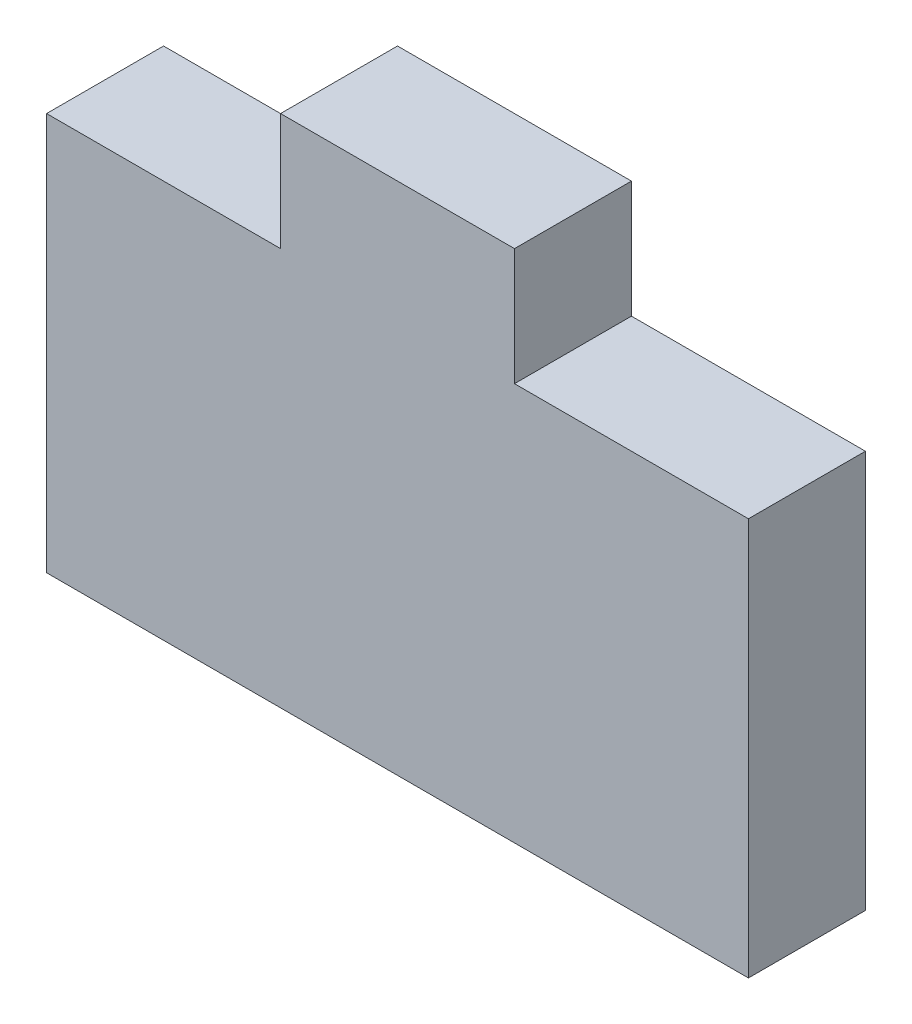
ISO-10303-21;
HEADER;
FILE_DESCRIPTION(('STEP AP214'),'2;1');
FILE_NAME('part.step','',(''),(''),'','','');
FILE_SCHEMA(('AUTOMOTIVE_DESIGN { 1 0 10303 214 1 1 1 1 }'));
ENDSEC;
DATA;
#1=APPLICATION_CONTEXT('core data for automotive mechanical design processes');
#2=APPLICATION_PROTOCOL_DEFINITION('international standard','automotive_design',2000,#1);
#3=PRODUCT_CONTEXT('',#1,'mechanical');
#4=PRODUCT('Part','Part','',(#3));
#5=PRODUCT_RELATED_PRODUCT_CATEGORY('part','',(#4));
#6=PRODUCT_DEFINITION_FORMATION('','',#4);
#7=PRODUCT_DEFINITION_CONTEXT('part definition',#1,'design');
#8=PRODUCT_DEFINITION('design','',#6,#7);
#9=PRODUCT_DEFINITION_SHAPE('','',#8);
#10=(LENGTH_UNIT() NAMED_UNIT(*) SI_UNIT(.MILLI.,.METRE.));
#11=(NAMED_UNIT(*) PLANE_ANGLE_UNIT() SI_UNIT($,.RADIAN.));
#12=(NAMED_UNIT(*) SI_UNIT($,.STERADIAN.) SOLID_ANGLE_UNIT());
#13=UNCERTAINTY_MEASURE_WITH_UNIT(LENGTH_MEASURE(1.E-05),#10,'distance_accuracy_value','');
#14=(GEOMETRIC_REPRESENTATION_CONTEXT(3) GLOBAL_UNCERTAINTY_ASSIGNED_CONTEXT((#13)) GLOBAL_UNIT_ASSIGNED_CONTEXT((#10,
#11,#12)) REPRESENTATION_CONTEXT('',''));
#15=CARTESIAN_POINT('',(0.,0.,0.));
#16=DIRECTION('',(0.,0.,1.));
#17=DIRECTION('',(1.,0.,0.));
#18=AXIS2_PLACEMENT_3D('',#15,#16,#17);
#19=CARTESIAN_POINT('',(38.1,0.,9.525));
#20=DIRECTION('',(1.,0.,0.));
#21=DIRECTION('',(0.,0.,-1.));
#22=AXIS2_PLACEMENT_3D('',#19,#20,#21);
#23=PLANE('',#22);
#24=DIRECTION('',(0.,-1.,0.));
#25=VECTOR('',#24,1.);
#26=CARTESIAN_POINT('',(38.1,0.,0.));
#27=LINE('',#26,#25);
#28=CARTESIAN_POINT('',(38.1,41.91,0.));
#29=VERTEX_POINT('',#28);
#30=CARTESIAN_POINT('',(38.1,32.385,0.));
#31=VERTEX_POINT('',#30);
#32=EDGE_CURVE('E138',#29,#31,#27,.T.);
#33=ORIENTED_EDGE('',*,*,#32,.F.);
#34=DIRECTION('',(0.,0.,-1.));
#35=VECTOR('',#34,1.);
#36=CARTESIAN_POINT('',(38.1,41.91,9.525));
#37=LINE('',#36,#35);
#38=CARTESIAN_POINT('',(38.1,41.91,9.525));
#39=VERTEX_POINT('',#38);
#40=EDGE_CURVE('E11',#39,#29,#37,.T.);
#41=ORIENTED_EDGE('',*,*,#40,.F.);
#42=DIRECTION('',(0.,-1.,0.));
#43=VECTOR('',#42,1.);
#44=CARTESIAN_POINT('',(38.1,0.,9.525));
#45=LINE('',#44,#43);
#46=CARTESIAN_POINT('',(38.1,32.385,9.525));
#47=VERTEX_POINT('',#46);
#48=EDGE_CURVE('E165',#39,#47,#45,.T.);
#49=ORIENTED_EDGE('',*,*,#48,.T.);
#50=DIRECTION('',(0.,0.,-1.));
#51=VECTOR('',#50,1.);
#52=CARTESIAN_POINT('',(38.1,32.385,9.525));
#53=LINE('',#52,#51);
#54=EDGE_CURVE('E93',#47,#31,#53,.T.);
#55=ORIENTED_EDGE('',*,*,#54,.T.);
#56=EDGE_LOOP('',(#33,#41,#49,#55));
#57=FACE_BOUND('',#56,.T.);
#58=ADVANCED_FACE('F41',(#57),#23,.T.);
#59=CARTESIAN_POINT('',(0.,41.91,9.525));
#60=DIRECTION('',(0.,1.,0.));
#61=DIRECTION('',(0.,0.,1.));
#62=AXIS2_PLACEMENT_3D('',#59,#60,#61);
#63=PLANE('',#62);
#64=DIRECTION('',(1.,0.,0.));
#65=VECTOR('',#64,1.);
#66=CARTESIAN_POINT('',(0.,41.91,0.));
#67=LINE('',#66,#65);
#68=CARTESIAN_POINT('',(19.05,41.91,0.));
#69=VERTEX_POINT('',#68);
#70=EDGE_CURVE('E142',#69,#29,#67,.T.);
#71=ORIENTED_EDGE('',*,*,#70,.F.);
#72=DIRECTION('',(0.,0.,-1.));
#73=VECTOR('',#72,1.);
#74=CARTESIAN_POINT('',(19.05,41.91,9.525));
#75=LINE('',#74,#73);
#76=CARTESIAN_POINT('',(19.05,41.91,9.525));
#77=VERTEX_POINT('',#76);
#78=EDGE_CURVE('E50',#77,#69,#75,.T.);
#79=ORIENTED_EDGE('',*,*,#78,.F.);
#80=DIRECTION('',(1.,0.,0.));
#81=VECTOR('',#80,1.);
#82=CARTESIAN_POINT('',(0.,41.91,9.525));
#83=LINE('',#82,#81);
#84=EDGE_CURVE('E192',#77,#39,#83,.T.);
#85=ORIENTED_EDGE('',*,*,#84,.T.);
#86=ORIENTED_EDGE('',*,*,#40,.T.);
#87=EDGE_LOOP('',(#71,#79,#85,#86));
#88=FACE_BOUND('',#87,.T.);
#89=ADVANCED_FACE('F191',(#88),#63,.T.);
#90=CARTESIAN_POINT('',(19.0499999999999,0.,9.525));
#91=DIRECTION('',(1.,0.,0.));
#92=DIRECTION('',(0.,1.,0.));
#93=AXIS2_PLACEMENT_3D('',#90,#91,#92);
#94=PLANE('',#93);
#95=DIRECTION('',(0.,-1.,0.));
#96=VECTOR('',#95,1.);
#97=CARTESIAN_POINT('',(19.0499999999999,0.,0.));
#98=LINE('',#97,#96);
#99=CARTESIAN_POINT('',(19.05,32.385,0.));
#100=VERTEX_POINT('',#99);
#101=EDGE_CURVE('E146',#69,#100,#98,.T.);
#102=ORIENTED_EDGE('',*,*,#101,.T.);
#103=DIRECTION('',(0.,0.,-1.));
#104=VECTOR('',#103,1.);
#105=CARTESIAN_POINT('',(19.05,32.385,9.525));
#106=LINE('',#105,#104);
#107=CARTESIAN_POINT('',(19.05,32.385,9.525));
#108=VERTEX_POINT('',#107);
#109=EDGE_CURVE('E175',#108,#100,#106,.T.);
#110=ORIENTED_EDGE('',*,*,#109,.F.);
#111=DIRECTION('',(0.,-1.,0.));
#112=VECTOR('',#111,1.);
#113=CARTESIAN_POINT('',(19.0499999999999,0.,9.525));
#114=LINE('',#113,#112);
#115=EDGE_CURVE('E183',#77,#108,#114,.T.);
#116=ORIENTED_EDGE('',*,*,#115,.F.);
#117=ORIENTED_EDGE('',*,*,#78,.T.);
#118=EDGE_LOOP('',(#102,#110,#116,#117));
#119=FACE_BOUND('',#118,.T.);
#120=ADVANCED_FACE('F181',(#119),#94,.F.);
#121=CARTESIAN_POINT('',(0.,32.385,9.525));
#122=DIRECTION('',(0.,1.,0.));
#123=DIRECTION('',(0.,0.,1.));
#124=AXIS2_PLACEMENT_3D('',#121,#122,#123);
#125=PLANE('',#124);
#126=DIRECTION('',(1.,0.,0.));
#127=VECTOR('',#126,1.);
#128=CARTESIAN_POINT('',(0.,32.385,0.));
#129=LINE('',#128,#127);
#130=CARTESIAN_POINT('',(0.,32.385,0.));
#131=VERTEX_POINT('',#130);
#132=EDGE_CURVE('E150',#131,#100,#129,.T.);
#133=ORIENTED_EDGE('',*,*,#132,.F.);
#134=DIRECTION('',(0.,0.,-1.));
#135=VECTOR('',#134,1.);
#136=CARTESIAN_POINT('',(0.,32.385,9.525));
#137=LINE('',#136,#135);
#138=CARTESIAN_POINT('',(0.,32.385,9.525));
#139=VERTEX_POINT('',#138);
#140=EDGE_CURVE('E172',#139,#131,#137,.T.);
#141=ORIENTED_EDGE('',*,*,#140,.F.);
#142=DIRECTION('',(1.,0.,0.));
#143=VECTOR('',#142,1.);
#144=CARTESIAN_POINT('',(0.,32.385,9.525));
#145=LINE('',#144,#143);
#146=EDGE_CURVE('E203',#139,#108,#145,.T.);
#147=ORIENTED_EDGE('',*,*,#146,.T.);
#148=ORIENTED_EDGE('',*,*,#109,.T.);
#149=EDGE_LOOP('',(#133,#141,#147,#148));
#150=FACE_BOUND('',#149,.T.);
#151=ADVANCED_FACE('F211',(#150),#125,.T.);
#152=CARTESIAN_POINT('',(0.,0.,9.525));
#153=DIRECTION('',(-1.,0.,0.));
#154=DIRECTION('',(0.,0.,1.));
#155=AXIS2_PLACEMENT_3D('',#152,#153,#154);
#156=PLANE('',#155);
#157=DIRECTION('',(0.,1.,0.));
#158=VECTOR('',#157,1.);
#159=CARTESIAN_POINT('',(0.,0.,0.));
#160=LINE('',#159,#158);
#161=CARTESIAN_POINT('',(0.,0.,0.));
#162=VERTEX_POINT('',#161);
#163=EDGE_CURVE('E154',#162,#131,#160,.T.);
#164=ORIENTED_EDGE('',*,*,#163,.F.);
#165=DIRECTION('',(0.,0.,-1.));
#166=VECTOR('',#165,1.);
#167=CARTESIAN_POINT('',(0.,0.,9.525));
#168=LINE('',#167,#166);
#169=CARTESIAN_POINT('',(0.,0.,9.525));
#170=VERTEX_POINT('',#169);
#171=EDGE_CURVE('E128',#170,#162,#168,.T.);
#172=ORIENTED_EDGE('',*,*,#171,.F.);
#173=DIRECTION('',(0.,1.,0.));
#174=VECTOR('',#173,1.);
#175=CARTESIAN_POINT('',(0.,0.,9.525));
#176=LINE('',#175,#174);
#177=EDGE_CURVE('E119',#170,#139,#176,.T.);
#178=ORIENTED_EDGE('',*,*,#177,.T.);
#179=ORIENTED_EDGE('',*,*,#140,.T.);
#180=EDGE_LOOP('',(#164,#172,#178,#179));
#181=FACE_BOUND('',#180,.T.);
#182=ADVANCED_FACE('F209',(#181),#156,.T.);
#183=CARTESIAN_POINT('',(0.,0.,9.525));
#184=DIRECTION('',(0.,1.,0.));
#185=DIRECTION('',(0.,0.,1.));
#186=AXIS2_PLACEMENT_3D('',#183,#184,#185);
#187=PLANE('',#186);
#188=DIRECTION('',(1.,0.,0.));
#189=VECTOR('',#188,1.);
#190=CARTESIAN_POINT('',(0.,0.,0.));
#191=LINE('',#190,#189);
#192=CARTESIAN_POINT('',(57.15,0.,0.));
#193=VERTEX_POINT('',#192);
#194=EDGE_CURVE('E126',#162,#193,#191,.T.);
#195=ORIENTED_EDGE('',*,*,#194,.T.);
#196=DIRECTION('',(0.,0.,-1.));
#197=VECTOR('',#196,1.);
#198=CARTESIAN_POINT('',(57.15,0.,9.525));
#199=LINE('',#198,#197);
#200=CARTESIAN_POINT('',(57.15,0.,9.525));
#201=VERTEX_POINT('',#200);
#202=EDGE_CURVE('E123',#201,#193,#199,.T.);
#203=ORIENTED_EDGE('',*,*,#202,.F.);
#204=DIRECTION('',(1.,0.,0.));
#205=VECTOR('',#204,1.);
#206=CARTESIAN_POINT('',(0.,0.,9.525));
#207=LINE('',#206,#205);
#208=EDGE_CURVE('E112',#170,#201,#207,.T.);
#209=ORIENTED_EDGE('',*,*,#208,.F.);
#210=ORIENTED_EDGE('',*,*,#171,.T.);
#211=EDGE_LOOP('',(#195,#203,#209,#210));
#212=FACE_BOUND('',#211,.T.);
#213=ADVANCED_FACE('F124',(#212),#187,.F.);
#214=CARTESIAN_POINT('',(57.15,0.,9.525));
#215=DIRECTION('',(-1.,0.,0.));
#216=DIRECTION('',(0.,-1.,0.));
#217=AXIS2_PLACEMENT_3D('',#214,#215,#216);
#218=PLANE('',#217);
#219=DIRECTION('',(0.,1.,0.));
#220=VECTOR('',#219,1.);
#221=CARTESIAN_POINT('',(57.15,0.,0.));
#222=LINE('',#221,#220);
#223=CARTESIAN_POINT('',(57.15,32.385,0.));
#224=VERTEX_POINT('',#223);
#225=EDGE_CURVE('E86',#193,#224,#222,.T.);
#226=ORIENTED_EDGE('',*,*,#225,.T.);
#227=DIRECTION('',(0.,0.,-1.));
#228=VECTOR('',#227,1.);
#229=CARTESIAN_POINT('',(57.15,32.385,9.525));
#230=LINE('',#229,#228);
#231=CARTESIAN_POINT('',(57.15,32.385,9.525));
#232=VERTEX_POINT('',#231);
#233=EDGE_CURVE('E129',#232,#224,#230,.T.);
#234=ORIENTED_EDGE('',*,*,#233,.F.);
#235=DIRECTION('',(0.,1.,0.));
#236=VECTOR('',#235,1.);
#237=CARTESIAN_POINT('',(57.15,0.,9.525));
#238=LINE('',#237,#236);
#239=EDGE_CURVE('E116',#201,#232,#238,.T.);
#240=ORIENTED_EDGE('',*,*,#239,.F.);
#241=ORIENTED_EDGE('',*,*,#202,.T.);
#242=EDGE_LOOP('',(#226,#234,#240,#241));
#243=FACE_BOUND('',#242,.T.);
#244=ADVANCED_FACE('F131',(#243),#218,.F.);
#245=CARTESIAN_POINT('',(0.,32.385,9.525));
#246=DIRECTION('',(0.,-1.,0.));
#247=DIRECTION('',(0.,0.,-1.));
#248=AXIS2_PLACEMENT_3D('',#245,#246,#247);
#249=PLANE('',#248);
#250=DIRECTION('',(-1.,0.,0.));
#251=VECTOR('',#250,1.);
#252=CARTESIAN_POINT('',(0.,32.385,0.));
#253=LINE('',#252,#251);
#254=EDGE_CURVE('E162',#224,#31,#253,.T.);
#255=ORIENTED_EDGE('',*,*,#254,.T.);
#256=ORIENTED_EDGE('',*,*,#54,.F.);
#257=DIRECTION('',(-1.,0.,0.));
#258=VECTOR('',#257,1.);
#259=CARTESIAN_POINT('',(0.,32.385,9.525));
#260=LINE('',#259,#258);
#261=EDGE_CURVE('E58',#232,#47,#260,.T.);
#262=ORIENTED_EDGE('',*,*,#261,.F.);
#263=ORIENTED_EDGE('',*,*,#233,.T.);
#264=EDGE_LOOP('',(#255,#256,#262,#263));
#265=FACE_BOUND('',#264,.T.);
#266=ADVANCED_FACE('F195',(#265),#249,.F.);
#267=CARTESIAN_POINT('',(0.,0.,9.525));
#268=DIRECTION('',(0.,0.,1.));
#269=DIRECTION('',(1.,0.,0.));
#270=AXIS2_PLACEMENT_3D('',#267,#268,#269);
#271=PLANE('',#270);
#272=ORIENTED_EDGE('',*,*,#48,.F.);
#273=ORIENTED_EDGE('',*,*,#84,.F.);
#274=ORIENTED_EDGE('',*,*,#115,.T.);
#275=ORIENTED_EDGE('',*,*,#146,.F.);
#276=ORIENTED_EDGE('',*,*,#177,.F.);
#277=ORIENTED_EDGE('',*,*,#208,.T.);
#278=ORIENTED_EDGE('',*,*,#239,.T.);
#279=ORIENTED_EDGE('',*,*,#261,.T.);
#280=EDGE_LOOP('',(#272,#273,#274,#275,#276,#277,#278,#279));
#281=FACE_BOUND('',#280,.T.);
#282=ADVANCED_FACE('F114',(#281),#271,.T.);
#283=CARTESIAN_POINT('',(0.,0.,0.));
#284=DIRECTION('',(0.,0.,1.));
#285=DIRECTION('',(1.,0.,0.));
#286=AXIS2_PLACEMENT_3D('',#283,#284,#285);
#287=PLANE('',#286);
#288=ORIENTED_EDGE('',*,*,#32,.T.);
#289=ORIENTED_EDGE('',*,*,#254,.F.);
#290=ORIENTED_EDGE('',*,*,#225,.F.);
#291=ORIENTED_EDGE('',*,*,#194,.F.);
#292=ORIENTED_EDGE('',*,*,#163,.T.);
#293=ORIENTED_EDGE('',*,*,#132,.T.);
#294=ORIENTED_EDGE('',*,*,#101,.F.);
#295=ORIENTED_EDGE('',*,*,#70,.T.);
#296=EDGE_LOOP('',(#288,#289,#290,#291,#292,#293,#294,#295));
#297=FACE_BOUND('',#296,.T.);
#298=ADVANCED_FACE('F189',(#297),#287,.F.);
#299=CLOSED_SHELL('',(#58,#89,#120,#151,#182,#213,#244,#266,#282,#298));
#300=MANIFOLD_SOLID_BREP('B2',#299);
#301=ADVANCED_BREP_SHAPE_REPRESENTATION('',(#18,#300),#14);
#302=SHAPE_DEFINITION_REPRESENTATION(#9,#301);
ENDSEC;
END-ISO-10303-21;
